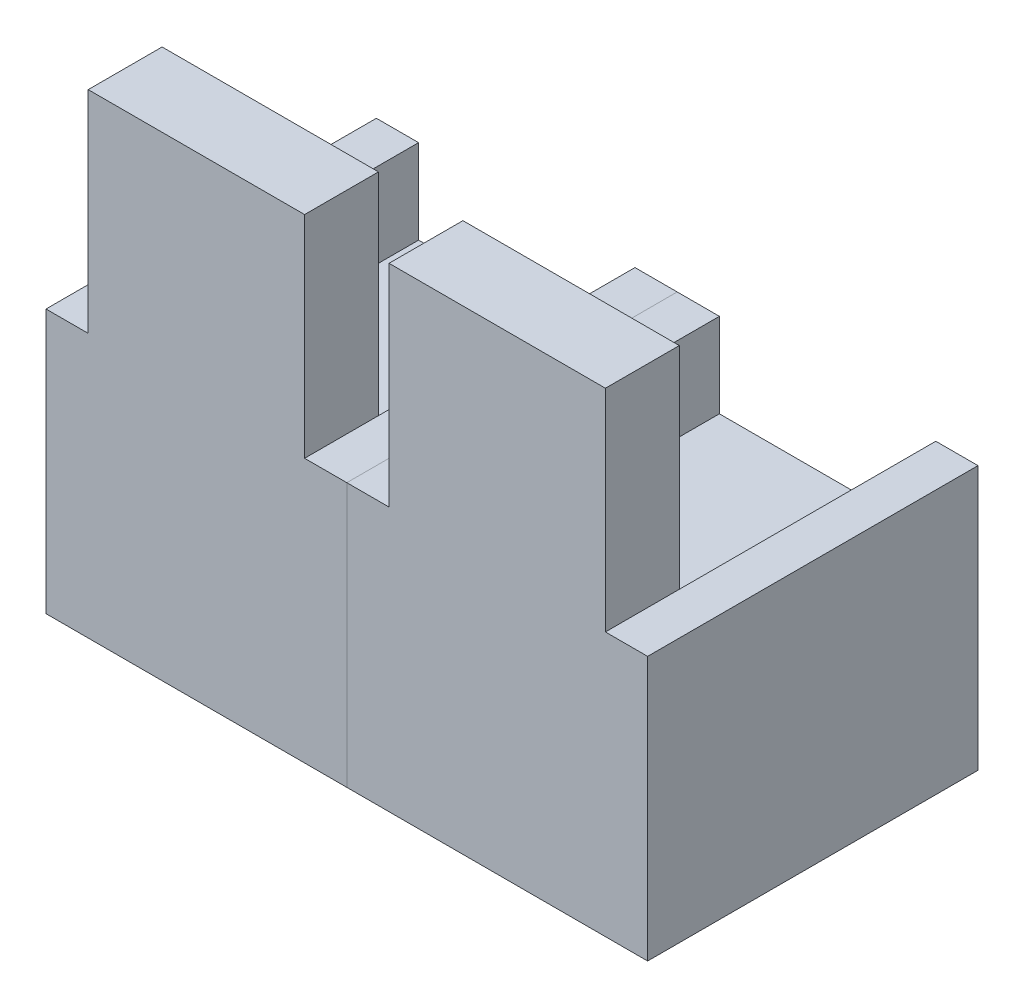
ISO-10303-21;
HEADER;
FILE_DESCRIPTION(('STEP AP214'),'2;1');
FILE_NAME('part.step','',(''),(''),'','','');
FILE_SCHEMA(('AUTOMOTIVE_DESIGN { 1 0 10303 214 1 1 1 1 }'));
ENDSEC;
DATA;
#1=APPLICATION_CONTEXT('core data for automotive mechanical design processes');
#2=APPLICATION_PROTOCOL_DEFINITION('international standard','automotive_design',2000,#1);
#3=PRODUCT_CONTEXT('',#1,'mechanical');
#4=PRODUCT('Part','Part','',(#3));
#5=PRODUCT_RELATED_PRODUCT_CATEGORY('part','',(#4));
#6=PRODUCT_DEFINITION_FORMATION('','',#4);
#7=PRODUCT_DEFINITION_CONTEXT('part definition',#1,'design');
#8=PRODUCT_DEFINITION('design','',#6,#7);
#9=PRODUCT_DEFINITION_SHAPE('','',#8);
#10=(LENGTH_UNIT() NAMED_UNIT(*) SI_UNIT(.MILLI.,.METRE.));
#11=(NAMED_UNIT(*) PLANE_ANGLE_UNIT() SI_UNIT($,.RADIAN.));
#12=(NAMED_UNIT(*) SI_UNIT($,.STERADIAN.) SOLID_ANGLE_UNIT());
#13=UNCERTAINTY_MEASURE_WITH_UNIT(LENGTH_MEASURE(1.E-05),#10,'distance_accuracy_value','');
#14=(GEOMETRIC_REPRESENTATION_CONTEXT(3) GLOBAL_UNCERTAINTY_ASSIGNED_CONTEXT((#13)) GLOBAL_UNIT_ASSIGNED_CONTEXT((#10,
#11,#12)) REPRESENTATION_CONTEXT('',''));
#15=CARTESIAN_POINT('',(0.,0.,0.));
#16=DIRECTION('',(0.,0.,1.));
#17=DIRECTION('',(1.,0.,0.));
#18=AXIS2_PLACEMENT_3D('',#15,#16,#17);
#19=CARTESIAN_POINT('',(723.9,431.8,0.));
#20=DIRECTION('',(0.,1.,0.));
#21=DIRECTION('',(0.,0.,1.));
#22=AXIS2_PLACEMENT_3D('',#19,#20,#21);
#23=PLANE('',#22);
#24=DIRECTION('',(0.,0.,-1.));
#25=VECTOR('',#24,1.);
#26=CARTESIAN_POINT('',(429.696051502146,431.8,0.));
#27=LINE('',#26,#25);
#28=CARTESIAN_POINT('',(429.696051502146,431.799999999999,617.22));
#29=VERTEX_POINT('',#28);
#30=CARTESIAN_POINT('',(429.696051502146,431.8,0.));
#31=VERTEX_POINT('',#30);
#32=EDGE_CURVE('E195',#29,#31,#27,.T.);
#33=ORIENTED_EDGE('',*,*,#32,.F.);
#34=DIRECTION('',(-1.,0.,0.));
#35=VECTOR('',#34,1.);
#36=CARTESIAN_POINT('',(429.696051502146,431.799999999999,617.22));
#37=LINE('',#36,#35);
#38=CARTESIAN_POINT('',(950.396051502146,431.799999999999,617.22));
#39=VERTEX_POINT('',#38);
#40=EDGE_CURVE('E160',#39,#29,#37,.T.);
#41=ORIENTED_EDGE('',*,*,#40,.F.);
#42=DIRECTION('',(0.,0.,1.));
#43=VECTOR('',#42,1.);
#44=CARTESIAN_POINT('',(950.396051502146,431.8,0.));
#45=LINE('',#44,#43);
#46=CARTESIAN_POINT('',(950.396051502147,431.8,0.));
#47=VERTEX_POINT('',#46);
#48=EDGE_CURVE('E66',#47,#39,#45,.T.);
#49=ORIENTED_EDGE('',*,*,#48,.F.);
#50=DIRECTION('',(-1.,0.,0.));
#51=VECTOR('',#50,1.);
#52=CARTESIAN_POINT('',(328.096051502146,431.8,0.));
#53=LINE('',#52,#51);
#54=EDGE_CURVE('E217',#47,#31,#53,.T.);
#55=ORIENTED_EDGE('',*,*,#54,.T.);
#56=EDGE_LOOP('',(#33,#41,#49,#55));
#57=FACE_BOUND('',#56,.T.);
#58=ADVANCED_FACE('F50',(#57),#23,.T.);
#59=CARTESIAN_POINT('',(429.696051502146,635.,0.));
#60=DIRECTION('',(-1.,0.,0.));
#61=DIRECTION('',(0.,0.,1.));
#62=AXIS2_PLACEMENT_3D('',#59,#60,#61);
#63=PLANE('',#62);
#64=DIRECTION('',(0.,-1.,0.));
#65=VECTOR('',#64,1.);
#66=CARTESIAN_POINT('',(429.696051502146,1143.,617.22));
#67=LINE('',#66,#65);
#68=CARTESIAN_POINT('',(429.696051502146,635.,617.22));
#69=VERTEX_POINT('',#68);
#70=EDGE_CURVE('E304',#69,#29,#67,.T.);
#71=ORIENTED_EDGE('',*,*,#70,.T.);
#72=ORIENTED_EDGE('',*,*,#32,.T.);
#73=DIRECTION('',(0.,-1.,0.));
#74=VECTOR('',#73,1.);
#75=CARTESIAN_POINT('',(429.696051502146,635.,0.));
#76=LINE('',#75,#74);
#77=CARTESIAN_POINT('',(429.696051502146,635.,0.));
#78=VERTEX_POINT('',#77);
#79=EDGE_CURVE('E210',#78,#31,#76,.T.);
#80=ORIENTED_EDGE('',*,*,#79,.F.);
#81=DIRECTION('',(0.,0.,-1.));
#82=VECTOR('',#81,1.);
#83=CARTESIAN_POINT('',(429.696051502146,635.,0.));
#84=LINE('',#83,#82);
#85=EDGE_CURVE('E203',#69,#78,#84,.T.);
#86=ORIENTED_EDGE('',*,*,#85,.F.);
#87=EDGE_LOOP('',(#71,#72,#80,#86));
#88=FACE_BOUND('',#87,.T.);
#89=ADVANCED_FACE('F257',(#88),#63,.F.);
#90=CARTESIAN_POINT('',(950.396051502146,635.000000000001,0.));
#91=DIRECTION('',(1.,0.,0.));
#92=DIRECTION('',(0.,0.,-1.));
#93=AXIS2_PLACEMENT_3D('',#90,#91,#92);
#94=PLANE('',#93);
#95=DIRECTION('',(0.,-1.,0.));
#96=VECTOR('',#95,1.);
#97=CARTESIAN_POINT('',(950.396051502147,1143.,617.22));
#98=LINE('',#97,#96);
#99=CARTESIAN_POINT('',(950.396051502146,635.000000000001,617.22));
#100=VERTEX_POINT('',#99);
#101=EDGE_CURVE('E265',#100,#39,#98,.T.);
#102=ORIENTED_EDGE('',*,*,#101,.F.);
#103=DIRECTION('',(0.,0.,1.));
#104=VECTOR('',#103,1.);
#105=CARTESIAN_POINT('',(950.396051502146,635.000000000001,0.));
#106=LINE('',#105,#104);
#107=CARTESIAN_POINT('',(950.396051502146,635.000000000001,0.));
#108=VERTEX_POINT('',#107);
#109=EDGE_CURVE('E183',#108,#100,#106,.T.);
#110=ORIENTED_EDGE('',*,*,#109,.F.);
#111=DIRECTION('',(0.,-1.,0.));
#112=VECTOR('',#111,1.);
#113=CARTESIAN_POINT('',(950.396051502146,635.000000000001,0.));
#114=LINE('',#113,#112);
#115=EDGE_CURVE('E190',#108,#47,#114,.T.);
#116=ORIENTED_EDGE('',*,*,#115,.T.);
#117=ORIENTED_EDGE('',*,*,#48,.T.);
#118=EDGE_LOOP('',(#102,#110,#116,#117));
#119=FACE_BOUND('',#118,.T.);
#120=ADVANCED_FACE('F264',(#119),#94,.F.);
#121=CARTESIAN_POINT('',(328.096051502146,431.8,0.));
#122=DIRECTION('',(1.,0.,0.));
#123=DIRECTION('',(0.,0.,-1.));
#124=AXIS2_PLACEMENT_3D('',#121,#122,#123);
#125=PLANE('',#124);
#126=DIRECTION('',(0.,0.,1.));
#127=VECTOR('',#126,1.);
#128=CARTESIAN_POINT('',(328.096051502146,0.,0.));
#129=LINE('',#128,#127);
#130=CARTESIAN_POINT('',(328.096051502146,0.,0.));
#131=VERTEX_POINT('',#130);
#132=CARTESIAN_POINT('',(328.096051502146,0.,795.020000000001));
#133=VERTEX_POINT('',#132);
#134=EDGE_CURVE('E216',#131,#133,#129,.T.);
#135=ORIENTED_EDGE('',*,*,#134,.T.);
#136=DIRECTION('',(0.,-1.,0.));
#137=VECTOR('',#136,1.);
#138=CARTESIAN_POINT('',(328.096051502146,431.8,795.020000000001));
#139=LINE('',#138,#137);
#140=CARTESIAN_POINT('',(328.096051502146,635.,795.020000000001));
#141=VERTEX_POINT('',#140);
#142=EDGE_CURVE('E12',#141,#133,#139,.T.);
#143=ORIENTED_EDGE('',*,*,#142,.F.);
#144=DIRECTION('',(0.,0.,1.));
#145=VECTOR('',#144,1.);
#146=CARTESIAN_POINT('',(328.096051502146,635.,0.));
#147=LINE('',#146,#145);
#148=CARTESIAN_POINT('',(328.096051502146,635.,0.));
#149=VERTEX_POINT('',#148);
#150=EDGE_CURVE('E196',#149,#141,#147,.T.);
#151=ORIENTED_EDGE('',*,*,#150,.F.);
#152=DIRECTION('',(0.,-1.,0.));
#153=VECTOR('',#152,1.);
#154=CARTESIAN_POINT('',(328.096051502146,431.8,0.));
#155=LINE('',#154,#153);
#156=EDGE_CURVE('E220',#149,#131,#155,.T.);
#157=ORIENTED_EDGE('',*,*,#156,.T.);
#158=EDGE_LOOP('',(#135,#143,#151,#157));
#159=FACE_BOUND('',#158,.T.);
#160=ADVANCED_FACE('F52',(#159),#125,.F.);
#161=CARTESIAN_POINT('',(328.096051502146,431.8,795.020000000001));
#162=DIRECTION('',(0.,0.,-1.));
#163=DIRECTION('',(-1.,0.,0.));
#164=AXIS2_PLACEMENT_3D('',#161,#162,#163);
#165=PLANE('',#164);
#166=DIRECTION('',(1.,0.,0.));
#167=VECTOR('',#166,1.);
#168=CARTESIAN_POINT('',(328.096051502146,0.,795.020000000001));
#169=LINE('',#168,#167);
#170=CARTESIAN_POINT('',(1051.99605150215,0.,795.020000000001));
#171=VERTEX_POINT('',#170);
#172=EDGE_CURVE('E224',#133,#171,#169,.T.);
#173=ORIENTED_EDGE('',*,*,#172,.T.);
#174=DIRECTION('',(0.,-1.,0.));
#175=VECTOR('',#174,1.);
#176=CARTESIAN_POINT('',(1051.99605150215,431.8,795.020000000001));
#177=LINE('',#176,#175);
#178=CARTESIAN_POINT('',(1051.99605150215,635.000000000001,795.020000000001));
#179=VERTEX_POINT('',#178);
#180=EDGE_CURVE('E59',#179,#171,#177,.T.);
#181=ORIENTED_EDGE('',*,*,#180,.F.);
#182=DIRECTION('',(1.,0.,0.));
#183=VECTOR('',#182,1.);
#184=CARTESIAN_POINT('',(1051.99605150215,635.000000000001,795.020000000001));
#185=LINE('',#184,#183);
#186=CARTESIAN_POINT('',(950.396051502147,635.000000000001,795.020000000001));
#187=VERTEX_POINT('',#186);
#188=EDGE_CURVE('E187',#187,#179,#185,.T.);
#189=ORIENTED_EDGE('',*,*,#188,.F.);
#190=DIRECTION('',(0.,-1.,0.));
#191=VECTOR('',#190,1.);
#192=CARTESIAN_POINT('',(950.396051502147,1143.,795.020000000001));
#193=LINE('',#192,#191);
#194=CARTESIAN_POINT('',(950.396051502147,1143.,795.020000000001));
#195=VERTEX_POINT('',#194);
#196=EDGE_CURVE('E145',#195,#187,#193,.T.);
#197=ORIENTED_EDGE('',*,*,#196,.F.);
#198=DIRECTION('',(1.,0.,0.));
#199=VECTOR('',#198,1.);
#200=CARTESIAN_POINT('',(429.696051502146,1143.,795.020000000001));
#201=LINE('',#200,#199);
#202=CARTESIAN_POINT('',(429.696051502146,1143.,795.020000000001));
#203=VERTEX_POINT('',#202);
#204=EDGE_CURVE('E137',#203,#195,#201,.T.);
#205=ORIENTED_EDGE('',*,*,#204,.F.);
#206=DIRECTION('',(0.,-1.,0.));
#207=VECTOR('',#206,1.);
#208=CARTESIAN_POINT('',(429.696051502146,1143.,795.020000000001));
#209=LINE('',#208,#207);
#210=CARTESIAN_POINT('',(429.696051502146,635.,795.020000000001));
#211=VERTEX_POINT('',#210);
#212=EDGE_CURVE('E142',#203,#211,#209,.T.);
#213=ORIENTED_EDGE('',*,*,#212,.T.);
#214=DIRECTION('',(1.,0.,0.));
#215=VECTOR('',#214,1.);
#216=CARTESIAN_POINT('',(328.096051502146,635.,795.020000000001));
#217=LINE('',#216,#215);
#218=EDGE_CURVE('E200',#141,#211,#217,.T.);
#219=ORIENTED_EDGE('',*,*,#218,.F.);
#220=ORIENTED_EDGE('',*,*,#142,.T.);
#221=EDGE_LOOP('',(#173,#181,#189,#197,#205,#213,#219,#220));
#222=FACE_BOUND('',#221,.T.);
#223=ADVANCED_FACE('F139',(#222),#165,.F.);
#224=CARTESIAN_POINT('',(1051.99605150215,431.8,0.));
#225=DIRECTION('',(-1.,0.,0.));
#226=DIRECTION('',(0.,0.,1.));
#227=AXIS2_PLACEMENT_3D('',#224,#225,#226);
#228=PLANE('',#227);
#229=DIRECTION('',(0.,0.,-1.));
#230=VECTOR('',#229,1.);
#231=CARTESIAN_POINT('',(1051.99605150215,0.,0.));
#232=LINE('',#231,#230);
#233=CARTESIAN_POINT('',(1051.99605150215,0.,0.));
#234=VERTEX_POINT('',#233);
#235=EDGE_CURVE('E227',#171,#234,#232,.T.);
#236=ORIENTED_EDGE('',*,*,#235,.T.);
#237=DIRECTION('',(0.,-1.,0.));
#238=VECTOR('',#237,1.);
#239=CARTESIAN_POINT('',(1051.99605150215,431.8,0.));
#240=LINE('',#239,#238);
#241=CARTESIAN_POINT('',(1051.99605150215,635.000000000001,0.));
#242=VERTEX_POINT('',#241);
#243=EDGE_CURVE('E234',#242,#234,#240,.T.);
#244=ORIENTED_EDGE('',*,*,#243,.F.);
#245=DIRECTION('',(0.,0.,-1.));
#246=VECTOR('',#245,1.);
#247=CARTESIAN_POINT('',(1051.99605150215,635.000000000001,0.));
#248=LINE('',#247,#246);
#249=EDGE_CURVE('E170',#179,#242,#248,.T.);
#250=ORIENTED_EDGE('',*,*,#249,.F.);
#251=ORIENTED_EDGE('',*,*,#180,.T.);
#252=EDGE_LOOP('',(#236,#244,#250,#251));
#253=FACE_BOUND('',#252,.T.);
#254=ADVANCED_FACE('F242',(#253),#228,.F.);
#255=CARTESIAN_POINT('',(328.096051502146,431.8,0.));
#256=DIRECTION('',(0.,0.,1.));
#257=DIRECTION('',(1.,0.,0.));
#258=AXIS2_PLACEMENT_3D('',#255,#256,#257);
#259=PLANE('',#258);
#260=DIRECTION('',(-1.,0.,0.));
#261=VECTOR('',#260,1.);
#262=CARTESIAN_POINT('',(328.096051502146,0.,0.));
#263=LINE('',#262,#261);
#264=EDGE_CURVE('E74',#234,#131,#263,.T.);
#265=ORIENTED_EDGE('',*,*,#264,.T.);
#266=ORIENTED_EDGE('',*,*,#156,.F.);
#267=DIRECTION('',(-1.,0.,0.));
#268=VECTOR('',#267,1.);
#269=CARTESIAN_POINT('',(328.096051502146,635.,0.));
#270=LINE('',#269,#268);
#271=EDGE_CURVE('E206',#78,#149,#270,.T.);
#272=ORIENTED_EDGE('',*,*,#271,.F.);
#273=ORIENTED_EDGE('',*,*,#79,.T.);
#274=ORIENTED_EDGE('',*,*,#54,.F.);
#275=ORIENTED_EDGE('',*,*,#115,.F.);
#276=DIRECTION('',(-1.,0.,0.));
#277=VECTOR('',#276,1.);
#278=CARTESIAN_POINT('',(1051.99605150215,635.000000000001,0.));
#279=LINE('',#278,#277);
#280=EDGE_CURVE('E179',#242,#108,#279,.T.);
#281=ORIENTED_EDGE('',*,*,#280,.F.);
#282=ORIENTED_EDGE('',*,*,#243,.T.);
#283=EDGE_LOOP('',(#265,#266,#272,#273,#274,#275,#281,#282));
#284=FACE_BOUND('',#283,.T.);
#285=ADVANCED_FACE('F249',(#284),#259,.F.);
#286=CARTESIAN_POINT('',(723.9,0.,0.));
#287=DIRECTION('',(0.,1.,0.));
#288=DIRECTION('',(0.,0.,1.));
#289=AXIS2_PLACEMENT_3D('',#286,#287,#288);
#290=PLANE('',#289);
#291=ORIENTED_EDGE('',*,*,#134,.F.);
#292=ORIENTED_EDGE('',*,*,#264,.F.);
#293=ORIENTED_EDGE('',*,*,#235,.F.);
#294=ORIENTED_EDGE('',*,*,#172,.F.);
#295=EDGE_LOOP('',(#291,#292,#293,#294));
#296=FACE_BOUND('',#295,.T.);
#297=ADVANCED_FACE('F245',(#296),#290,.F.);
#298=CARTESIAN_POINT('',(723.9,635.000000000001,0.));
#299=DIRECTION('',(0.,1.,0.));
#300=DIRECTION('',(0.,0.,1.));
#301=AXIS2_PLACEMENT_3D('',#298,#299,#300);
#302=PLANE('',#301);
#303=ORIENTED_EDGE('',*,*,#150,.T.);
#304=ORIENTED_EDGE('',*,*,#218,.T.);
#305=EDGE_CURVE('E164',#211,#69,#84,.T.);
#306=ORIENTED_EDGE('',*,*,#305,.T.);
#307=ORIENTED_EDGE('',*,*,#85,.T.);
#308=ORIENTED_EDGE('',*,*,#271,.T.);
#309=EDGE_LOOP('',(#303,#304,#306,#307,#308));
#310=FACE_BOUND('',#309,.T.);
#311=ADVANCED_FACE('F251',(#310),#302,.T.);
#312=CARTESIAN_POINT('',(723.9,635.000000000001,0.));
#313=DIRECTION('',(0.,-1.,0.));
#314=DIRECTION('',(0.,0.,-1.));
#315=AXIS2_PLACEMENT_3D('',#312,#313,#314);
#316=PLANE('',#315);
#317=ORIENTED_EDGE('',*,*,#249,.T.);
#318=ORIENTED_EDGE('',*,*,#280,.T.);
#319=ORIENTED_EDGE('',*,*,#109,.T.);
#320=EDGE_CURVE('E182',#100,#187,#106,.T.);
#321=ORIENTED_EDGE('',*,*,#320,.T.);
#322=ORIENTED_EDGE('',*,*,#188,.T.);
#323=EDGE_LOOP('',(#317,#318,#319,#321,#322));
#324=FACE_BOUND('',#323,.T.);
#325=ADVANCED_FACE('F268',(#324),#316,.F.);
#326=CARTESIAN_POINT('',(950.396051502147,1143.,617.22));
#327=DIRECTION('',(-1.,0.,0.));
#328=DIRECTION('',(0.,0.,1.));
#329=AXIS2_PLACEMENT_3D('',#326,#327,#328);
#330=PLANE('',#329);
#331=ORIENTED_EDGE('',*,*,#196,.T.);
#332=ORIENTED_EDGE('',*,*,#320,.F.);
#333=CARTESIAN_POINT('',(950.396051502147,1143.,617.22));
#334=VERTEX_POINT('',#333);
#335=EDGE_CURVE('E172',#334,#100,#98,.T.);
#336=ORIENTED_EDGE('',*,*,#335,.F.);
#337=DIRECTION('',(0.,0.,-1.));
#338=VECTOR('',#337,1.);
#339=CARTESIAN_POINT('',(950.396051502147,1143.,617.22));
#340=LINE('',#339,#338);
#341=EDGE_CURVE('E149',#195,#334,#340,.T.);
#342=ORIENTED_EDGE('',*,*,#341,.F.);
#343=EDGE_LOOP('',(#331,#332,#336,#342));
#344=FACE_BOUND('',#343,.T.);
#345=ADVANCED_FACE('F294',(#344),#330,.F.);
#346=CARTESIAN_POINT('',(429.696051502146,1143.,617.22));
#347=DIRECTION('',(1.,0.,0.));
#348=DIRECTION('',(0.,0.,-1.));
#349=AXIS2_PLACEMENT_3D('',#346,#347,#348);
#350=PLANE('',#349);
#351=ORIENTED_EDGE('',*,*,#305,.F.);
#352=ORIENTED_EDGE('',*,*,#212,.F.);
#353=DIRECTION('',(0.,0.,1.));
#354=VECTOR('',#353,1.);
#355=CARTESIAN_POINT('',(429.696051502146,1143.,617.22));
#356=LINE('',#355,#354);
#357=CARTESIAN_POINT('',(429.696051502146,1143.,617.22));
#358=VERTEX_POINT('',#357);
#359=EDGE_CURVE('E150',#358,#203,#356,.T.);
#360=ORIENTED_EDGE('',*,*,#359,.F.);
#361=EDGE_CURVE('E300',#358,#69,#67,.T.);
#362=ORIENTED_EDGE('',*,*,#361,.T.);
#363=EDGE_LOOP('',(#351,#352,#360,#362));
#364=FACE_BOUND('',#363,.T.);
#365=ADVANCED_FACE('F162',(#364),#350,.F.);
#366=CARTESIAN_POINT('',(429.696051502146,1143.,617.22));
#367=DIRECTION('',(0.,0.,1.));
#368=DIRECTION('',(1.,0.,0.));
#369=AXIS2_PLACEMENT_3D('',#366,#367,#368);
#370=PLANE('',#369);
#371=ORIENTED_EDGE('',*,*,#40,.T.);
#372=ORIENTED_EDGE('',*,*,#70,.F.);
#373=ORIENTED_EDGE('',*,*,#361,.F.);
#374=DIRECTION('',(-1.,0.,0.));
#375=VECTOR('',#374,1.);
#376=CARTESIAN_POINT('',(429.696051502146,1143.,617.22));
#377=LINE('',#376,#375);
#378=EDGE_CURVE('E155',#334,#358,#377,.T.);
#379=ORIENTED_EDGE('',*,*,#378,.F.);
#380=ORIENTED_EDGE('',*,*,#335,.T.);
#381=ORIENTED_EDGE('',*,*,#101,.T.);
#382=EDGE_LOOP('',(#371,#372,#373,#379,#380,#381));
#383=FACE_BOUND('',#382,.T.);
#384=ADVANCED_FACE('F296',(#383),#370,.F.);
#385=CARTESIAN_POINT('',(723.9,1143.,0.));
#386=DIRECTION('',(0.,1.,0.));
#387=DIRECTION('',(0.,0.,1.));
#388=AXIS2_PLACEMENT_3D('',#385,#386,#387);
#389=PLANE('',#388);
#390=ORIENTED_EDGE('',*,*,#359,.T.);
#391=ORIENTED_EDGE('',*,*,#204,.T.);
#392=ORIENTED_EDGE('',*,*,#341,.T.);
#393=ORIENTED_EDGE('',*,*,#378,.T.);
#394=EDGE_LOOP('',(#390,#391,#392,#393));
#395=FACE_BOUND('',#394,.T.);
#396=ADVANCED_FACE('F153',(#395),#389,.T.);
#397=CLOSED_SHELL('',(#58,#89,#120,#160,#223,#254,#285,#297,#311,#325,#345,#365,#384,#396));
#398=MANIFOLD_SOLID_BREP('B2',#397);
#399=CARTESIAN_POINT('',(0.,431.8,0.));
#400=DIRECTION('',(0.,1.,0.));
#401=DIRECTION('',(0.,0.,1.));
#402=AXIS2_PLACEMENT_3D('',#399,#400,#401);
#403=PLANE('',#402);
#404=DIRECTION('',(0.,0.,-1.));
#405=VECTOR('',#404,1.);
#406=CARTESIAN_POINT('',(-294.203948497854,431.8,0.));
#407=LINE('',#406,#405);
#408=CARTESIAN_POINT('',(-294.203948497853,431.799999999999,617.22));
#409=VERTEX_POINT('',#408);
#410=CARTESIAN_POINT('',(-294.203948497854,431.8,0.));
#411=VERTEX_POINT('',#410);
#412=EDGE_CURVE('E599',#409,#411,#407,.T.);
#413=ORIENTED_EDGE('',*,*,#412,.F.);
#414=DIRECTION('',(-1.,0.,0.));
#415=VECTOR('',#414,1.);
#416=CARTESIAN_POINT('',(-294.203948497853,431.799999999999,617.22));
#417=LINE('',#416,#415);
#418=CARTESIAN_POINT('',(226.496051502147,431.799999999999,617.22));
#419=VERTEX_POINT('',#418);
#420=EDGE_CURVE('E564',#419,#409,#417,.T.);
#421=ORIENTED_EDGE('',*,*,#420,.F.);
#422=DIRECTION('',(0.,0.,1.));
#423=VECTOR('',#422,1.);
#424=CARTESIAN_POINT('',(226.496051502146,431.8,0.));
#425=LINE('',#424,#423);
#426=CARTESIAN_POINT('',(226.496051502146,431.8,0.));
#427=VERTEX_POINT('',#426);
#428=EDGE_CURVE('E470',#427,#419,#425,.T.);
#429=ORIENTED_EDGE('',*,*,#428,.F.);
#430=DIRECTION('',(-1.,0.,0.));
#431=VECTOR('',#430,1.);
#432=CARTESIAN_POINT('',(-395.803948497854,431.8,0.));
#433=LINE('',#432,#431);
#434=EDGE_CURVE('E621',#427,#411,#433,.T.);
#435=ORIENTED_EDGE('',*,*,#434,.T.);
#436=EDGE_LOOP('',(#413,#421,#429,#435));
#437=FACE_BOUND('',#436,.T.);
#438=ADVANCED_FACE('F454',(#437),#403,.T.);
#439=CARTESIAN_POINT('',(-294.203948497854,635.000000000001,0.));
#440=DIRECTION('',(-1.,0.,0.));
#441=DIRECTION('',(0.,0.,1.));
#442=AXIS2_PLACEMENT_3D('',#439,#440,#441);
#443=PLANE('',#442);
#444=DIRECTION('',(0.,-1.,0.));
#445=VECTOR('',#444,1.);
#446=CARTESIAN_POINT('',(-294.203948497854,1143.,617.22));
#447=LINE('',#446,#445);
#448=CARTESIAN_POINT('',(-294.203948497853,635.000000000001,617.22));
#449=VERTEX_POINT('',#448);
#450=EDGE_CURVE('E708',#449,#409,#447,.T.);
#451=ORIENTED_EDGE('',*,*,#450,.T.);
#452=ORIENTED_EDGE('',*,*,#412,.T.);
#453=DIRECTION('',(0.,-1.,0.));
#454=VECTOR('',#453,1.);
#455=CARTESIAN_POINT('',(-294.203948497854,635.000000000001,0.));
#456=LINE('',#455,#454);
#457=CARTESIAN_POINT('',(-294.203948497854,635.000000000001,0.));
#458=VERTEX_POINT('',#457);
#459=EDGE_CURVE('E614',#458,#411,#456,.T.);
#460=ORIENTED_EDGE('',*,*,#459,.F.);
#461=DIRECTION('',(0.,0.,-1.));
#462=VECTOR('',#461,1.);
#463=CARTESIAN_POINT('',(-294.203948497854,635.000000000001,0.));
#464=LINE('',#463,#462);
#465=EDGE_CURVE('E607',#449,#458,#464,.T.);
#466=ORIENTED_EDGE('',*,*,#465,.F.);
#467=EDGE_LOOP('',(#451,#452,#460,#466));
#468=FACE_BOUND('',#467,.T.);
#469=ADVANCED_FACE('F661',(#468),#443,.F.);
#470=CARTESIAN_POINT('',(226.496051502146,635.,0.));
#471=DIRECTION('',(1.,0.,0.));
#472=DIRECTION('',(0.,0.,-1.));
#473=AXIS2_PLACEMENT_3D('',#470,#471,#472);
#474=PLANE('',#473);
#475=DIRECTION('',(0.,-1.,0.));
#476=VECTOR('',#475,1.);
#477=CARTESIAN_POINT('',(226.496051502146,1143.,617.22));
#478=LINE('',#477,#476);
#479=CARTESIAN_POINT('',(226.496051502147,635.,617.22));
#480=VERTEX_POINT('',#479);
#481=EDGE_CURVE('E669',#480,#419,#478,.T.);
#482=ORIENTED_EDGE('',*,*,#481,.F.);
#483=DIRECTION('',(0.,0.,1.));
#484=VECTOR('',#483,1.);
#485=CARTESIAN_POINT('',(226.496051502146,635.,0.));
#486=LINE('',#485,#484);
#487=CARTESIAN_POINT('',(226.496051502146,635.,0.));
#488=VERTEX_POINT('',#487);
#489=EDGE_CURVE('E587',#488,#480,#486,.T.);
#490=ORIENTED_EDGE('',*,*,#489,.F.);
#491=DIRECTION('',(0.,-1.,0.));
#492=VECTOR('',#491,1.);
#493=CARTESIAN_POINT('',(226.496051502146,635.,0.));
#494=LINE('',#493,#492);
#495=EDGE_CURVE('E594',#488,#427,#494,.T.);
#496=ORIENTED_EDGE('',*,*,#495,.T.);
#497=ORIENTED_EDGE('',*,*,#428,.T.);
#498=EDGE_LOOP('',(#482,#490,#496,#497));
#499=FACE_BOUND('',#498,.T.);
#500=ADVANCED_FACE('F668',(#499),#474,.F.);
#501=CARTESIAN_POINT('',(-395.803948497854,431.8,0.));
#502=DIRECTION('',(1.,0.,0.));
#503=DIRECTION('',(0.,0.,-1.));
#504=AXIS2_PLACEMENT_3D('',#501,#502,#503);
#505=PLANE('',#504);
#506=DIRECTION('',(0.,0.,1.));
#507=VECTOR('',#506,1.);
#508=CARTESIAN_POINT('',(-395.803948497854,0.,0.));
#509=LINE('',#508,#507);
#510=CARTESIAN_POINT('',(-395.803948497854,0.,0.));
#511=VERTEX_POINT('',#510);
#512=CARTESIAN_POINT('',(-395.803948497853,0.,795.020000000001));
#513=VERTEX_POINT('',#512);
#514=EDGE_CURVE('E620',#511,#513,#509,.T.);
#515=ORIENTED_EDGE('',*,*,#514,.T.);
#516=DIRECTION('',(0.,-1.,0.));
#517=VECTOR('',#516,1.);
#518=CARTESIAN_POINT('',(-395.803948497853,431.8,795.020000000001));
#519=LINE('',#518,#517);
#520=CARTESIAN_POINT('',(-395.803948497853,635.000000000001,795.020000000001));
#521=VERTEX_POINT('',#520);
#522=EDGE_CURVE('E48',#521,#513,#519,.T.);
#523=ORIENTED_EDGE('',*,*,#522,.F.);
#524=DIRECTION('',(0.,0.,1.));
#525=VECTOR('',#524,1.);
#526=CARTESIAN_POINT('',(-395.803948497854,635.000000000001,0.));
#527=LINE('',#526,#525);
#528=CARTESIAN_POINT('',(-395.803948497854,635.000000000001,0.));
#529=VERTEX_POINT('',#528);
#530=EDGE_CURVE('E600',#529,#521,#527,.T.);
#531=ORIENTED_EDGE('',*,*,#530,.F.);
#532=DIRECTION('',(0.,-1.,0.));
#533=VECTOR('',#532,1.);
#534=CARTESIAN_POINT('',(-395.803948497854,431.8,0.));
#535=LINE('',#534,#533);
#536=EDGE_CURVE('E624',#529,#511,#535,.T.);
#537=ORIENTED_EDGE('',*,*,#536,.T.);
#538=EDGE_LOOP('',(#515,#523,#531,#537));
#539=FACE_BOUND('',#538,.T.);
#540=ADVANCED_FACE('F456',(#539),#505,.F.);
#541=CARTESIAN_POINT('',(-395.803948497853,431.8,795.020000000001));
#542=DIRECTION('',(0.,0.,-1.));
#543=DIRECTION('',(-1.,0.,0.));
#544=AXIS2_PLACEMENT_3D('',#541,#542,#543);
#545=PLANE('',#544);
#546=DIRECTION('',(1.,0.,0.));
#547=VECTOR('',#546,1.);
#548=CARTESIAN_POINT('',(-395.803948497853,0.,795.020000000001));
#549=LINE('',#548,#547);
#550=CARTESIAN_POINT('',(328.096051502146,0.,795.020000000001));
#551=VERTEX_POINT('',#550);
#552=EDGE_CURVE('E628',#513,#551,#549,.T.);
#553=ORIENTED_EDGE('',*,*,#552,.T.);
#554=DIRECTION('',(0.,-1.,0.));
#555=VECTOR('',#554,1.);
#556=CARTESIAN_POINT('',(328.096051502146,431.8,795.020000000001));
#557=LINE('',#556,#555);
#558=CARTESIAN_POINT('',(328.096051502146,635.,795.020000000001));
#559=VERTEX_POINT('',#558);
#560=EDGE_CURVE('E463',#559,#551,#557,.T.);
#561=ORIENTED_EDGE('',*,*,#560,.F.);
#562=DIRECTION('',(1.,0.,0.));
#563=VECTOR('',#562,1.);
#564=CARTESIAN_POINT('',(328.096051502146,635.,795.020000000001));
#565=LINE('',#564,#563);
#566=CARTESIAN_POINT('',(226.496051502146,635.,795.020000000001));
#567=VERTEX_POINT('',#566);
#568=EDGE_CURVE('E591',#567,#559,#565,.T.);
#569=ORIENTED_EDGE('',*,*,#568,.F.);
#570=DIRECTION('',(0.,-1.,0.));
#571=VECTOR('',#570,1.);
#572=CARTESIAN_POINT('',(226.496051502147,1143.,795.020000000001));
#573=LINE('',#572,#571);
#574=CARTESIAN_POINT('',(226.496051502147,1143.,795.020000000001));
#575=VERTEX_POINT('',#574);
#576=EDGE_CURVE('E549',#575,#567,#573,.T.);
#577=ORIENTED_EDGE('',*,*,#576,.F.);
#578=DIRECTION('',(1.,0.,0.));
#579=VECTOR('',#578,1.);
#580=CARTESIAN_POINT('',(-294.203948497854,1143.,795.020000000001));
#581=LINE('',#580,#579);
#582=CARTESIAN_POINT('',(-294.203948497854,1143.,795.020000000001));
#583=VERTEX_POINT('',#582);
#584=EDGE_CURVE('E541',#583,#575,#581,.T.);
#585=ORIENTED_EDGE('',*,*,#584,.F.);
#586=DIRECTION('',(0.,-1.,0.));
#587=VECTOR('',#586,1.);
#588=CARTESIAN_POINT('',(-294.203948497854,1143.,795.020000000001));
#589=LINE('',#588,#587);
#590=CARTESIAN_POINT('',(-294.203948497853,635.000000000001,795.020000000001));
#591=VERTEX_POINT('',#590);
#592=EDGE_CURVE('E546',#583,#591,#589,.T.);
#593=ORIENTED_EDGE('',*,*,#592,.T.);
#594=DIRECTION('',(1.,0.,0.));
#595=VECTOR('',#594,1.);
#596=CARTESIAN_POINT('',(-395.803948497853,635.000000000001,795.020000000001));
#597=LINE('',#596,#595);
#598=EDGE_CURVE('E604',#521,#591,#597,.T.);
#599=ORIENTED_EDGE('',*,*,#598,.F.);
#600=ORIENTED_EDGE('',*,*,#522,.T.);
#601=EDGE_LOOP('',(#553,#561,#569,#577,#585,#593,#599,#600));
#602=FACE_BOUND('',#601,.T.);
#603=ADVANCED_FACE('F543',(#602),#545,.F.);
#604=CARTESIAN_POINT('',(328.096051502146,431.8,0.));
#605=DIRECTION('',(-1.,0.,0.));
#606=DIRECTION('',(0.,0.,1.));
#607=AXIS2_PLACEMENT_3D('',#604,#605,#606);
#608=PLANE('',#607);
#609=DIRECTION('',(0.,0.,-1.));
#610=VECTOR('',#609,1.);
#611=CARTESIAN_POINT('',(328.096051502146,0.,0.));
#612=LINE('',#611,#610);
#613=CARTESIAN_POINT('',(328.096051502146,0.,0.));
#614=VERTEX_POINT('',#613);
#615=EDGE_CURVE('E631',#551,#614,#612,.T.);
#616=ORIENTED_EDGE('',*,*,#615,.T.);
#617=DIRECTION('',(0.,-1.,0.));
#618=VECTOR('',#617,1.);
#619=CARTESIAN_POINT('',(328.096051502146,431.8,0.));
#620=LINE('',#619,#618);
#621=CARTESIAN_POINT('',(328.096051502146,635.,0.));
#622=VERTEX_POINT('',#621);
#623=EDGE_CURVE('E638',#622,#614,#620,.T.);
#624=ORIENTED_EDGE('',*,*,#623,.F.);
#625=DIRECTION('',(0.,0.,-1.));
#626=VECTOR('',#625,1.);
#627=CARTESIAN_POINT('',(328.096051502146,635.,0.));
#628=LINE('',#627,#626);
#629=EDGE_CURVE('E574',#559,#622,#628,.T.);
#630=ORIENTED_EDGE('',*,*,#629,.F.);
#631=ORIENTED_EDGE('',*,*,#560,.T.);
#632=EDGE_LOOP('',(#616,#624,#630,#631));
#633=FACE_BOUND('',#632,.T.);
#634=ADVANCED_FACE('F646',(#633),#608,.F.);
#635=CARTESIAN_POINT('',(-395.803948497854,431.8,0.));
#636=DIRECTION('',(0.,0.,1.));
#637=DIRECTION('',(1.,0.,0.));
#638=AXIS2_PLACEMENT_3D('',#635,#636,#637);
#639=PLANE('',#638);
#640=DIRECTION('',(-1.,0.,0.));
#641=VECTOR('',#640,1.);
#642=CARTESIAN_POINT('',(-395.803948497854,0.,0.));
#643=LINE('',#642,#641);
#644=EDGE_CURVE('E478',#614,#511,#643,.T.);
#645=ORIENTED_EDGE('',*,*,#644,.T.);
#646=ORIENTED_EDGE('',*,*,#536,.F.);
#647=DIRECTION('',(-1.,0.,0.));
#648=VECTOR('',#647,1.);
#649=CARTESIAN_POINT('',(-395.803948497854,635.000000000001,0.));
#650=LINE('',#649,#648);
#651=EDGE_CURVE('E610',#458,#529,#650,.T.);
#652=ORIENTED_EDGE('',*,*,#651,.F.);
#653=ORIENTED_EDGE('',*,*,#459,.T.);
#654=ORIENTED_EDGE('',*,*,#434,.F.);
#655=ORIENTED_EDGE('',*,*,#495,.F.);
#656=DIRECTION('',(-1.,0.,0.));
#657=VECTOR('',#656,1.);
#658=CARTESIAN_POINT('',(328.096051502146,635.,0.));
#659=LINE('',#658,#657);
#660=EDGE_CURVE('E583',#622,#488,#659,.T.);
#661=ORIENTED_EDGE('',*,*,#660,.F.);
#662=ORIENTED_EDGE('',*,*,#623,.T.);
#663=EDGE_LOOP('',(#645,#646,#652,#653,#654,#655,#661,#662));
#664=FACE_BOUND('',#663,.T.);
#665=ADVANCED_FACE('F653',(#664),#639,.F.);
#666=CARTESIAN_POINT('',(0.,0.,0.));
#667=DIRECTION('',(0.,1.,0.));
#668=DIRECTION('',(0.,0.,1.));
#669=AXIS2_PLACEMENT_3D('',#666,#667,#668);
#670=PLANE('',#669);
#671=ORIENTED_EDGE('',*,*,#514,.F.);
#672=ORIENTED_EDGE('',*,*,#644,.F.);
#673=ORIENTED_EDGE('',*,*,#615,.F.);
#674=ORIENTED_EDGE('',*,*,#552,.F.);
#675=EDGE_LOOP('',(#671,#672,#673,#674));
#676=FACE_BOUND('',#675,.T.);
#677=ADVANCED_FACE('F649',(#676),#670,.F.);
#678=CARTESIAN_POINT('',(0.,635.,0.));
#679=DIRECTION('',(0.,1.,0.));
#680=DIRECTION('',(0.,0.,1.));
#681=AXIS2_PLACEMENT_3D('',#678,#679,#680);
#682=PLANE('',#681);
#683=ORIENTED_EDGE('',*,*,#530,.T.);
#684=ORIENTED_EDGE('',*,*,#598,.T.);
#685=EDGE_CURVE('E568',#591,#449,#464,.T.);
#686=ORIENTED_EDGE('',*,*,#685,.T.);
#687=ORIENTED_EDGE('',*,*,#465,.T.);
#688=ORIENTED_EDGE('',*,*,#651,.T.);
#689=EDGE_LOOP('',(#683,#684,#686,#687,#688));
#690=FACE_BOUND('',#689,.T.);
#691=ADVANCED_FACE('F655',(#690),#682,.T.);
#692=CARTESIAN_POINT('',(0.,635.,0.));
#693=DIRECTION('',(0.,-1.,0.));
#694=DIRECTION('',(0.,0.,-1.));
#695=AXIS2_PLACEMENT_3D('',#692,#693,#694);
#696=PLANE('',#695);
#697=ORIENTED_EDGE('',*,*,#629,.T.);
#698=ORIENTED_EDGE('',*,*,#660,.T.);
#699=ORIENTED_EDGE('',*,*,#489,.T.);
#700=EDGE_CURVE('E586',#480,#567,#486,.T.);
#701=ORIENTED_EDGE('',*,*,#700,.T.);
#702=ORIENTED_EDGE('',*,*,#568,.T.);
#703=EDGE_LOOP('',(#697,#698,#699,#701,#702));
#704=FACE_BOUND('',#703,.T.);
#705=ADVANCED_FACE('F672',(#704),#696,.F.);
#706=CARTESIAN_POINT('',(226.496051502146,1143.,617.22));
#707=DIRECTION('',(-1.,0.,0.));
#708=DIRECTION('',(0.,0.,1.));
#709=AXIS2_PLACEMENT_3D('',#706,#707,#708);
#710=PLANE('',#709);
#711=ORIENTED_EDGE('',*,*,#576,.T.);
#712=ORIENTED_EDGE('',*,*,#700,.F.);
#713=CARTESIAN_POINT('',(226.496051502146,1143.,617.22));
#714=VERTEX_POINT('',#713);
#715=EDGE_CURVE('E576',#714,#480,#478,.T.);
#716=ORIENTED_EDGE('',*,*,#715,.F.);
#717=DIRECTION('',(0.,0.,-1.));
#718=VECTOR('',#717,1.);
#719=CARTESIAN_POINT('',(226.496051502146,1143.,617.22));
#720=LINE('',#719,#718);
#721=EDGE_CURVE('E553',#575,#714,#720,.T.);
#722=ORIENTED_EDGE('',*,*,#721,.F.);
#723=EDGE_LOOP('',(#711,#712,#716,#722));
#724=FACE_BOUND('',#723,.T.);
#725=ADVANCED_FACE('F698',(#724),#710,.F.);
#726=CARTESIAN_POINT('',(-294.203948497854,1143.,617.22));
#727=DIRECTION('',(1.,0.,0.));
#728=DIRECTION('',(0.,0.,-1.));
#729=AXIS2_PLACEMENT_3D('',#726,#727,#728);
#730=PLANE('',#729);
#731=ORIENTED_EDGE('',*,*,#685,.F.);
#732=ORIENTED_EDGE('',*,*,#592,.F.);
#733=DIRECTION('',(0.,0.,1.));
#734=VECTOR('',#733,1.);
#735=CARTESIAN_POINT('',(-294.203948497854,1143.,617.22));
#736=LINE('',#735,#734);
#737=CARTESIAN_POINT('',(-294.203948497854,1143.,617.22));
#738=VERTEX_POINT('',#737);
#739=EDGE_CURVE('E554',#738,#583,#736,.T.);
#740=ORIENTED_EDGE('',*,*,#739,.F.);
#741=EDGE_CURVE('E704',#738,#449,#447,.T.);
#742=ORIENTED_EDGE('',*,*,#741,.T.);
#743=EDGE_LOOP('',(#731,#732,#740,#742));
#744=FACE_BOUND('',#743,.T.);
#745=ADVANCED_FACE('F566',(#744),#730,.F.);
#746=CARTESIAN_POINT('',(-294.203948497854,1143.,617.22));
#747=DIRECTION('',(0.,0.,1.));
#748=DIRECTION('',(1.,0.,0.));
#749=AXIS2_PLACEMENT_3D('',#746,#747,#748);
#750=PLANE('',#749);
#751=ORIENTED_EDGE('',*,*,#420,.T.);
#752=ORIENTED_EDGE('',*,*,#450,.F.);
#753=ORIENTED_EDGE('',*,*,#741,.F.);
#754=DIRECTION('',(-1.,0.,0.));
#755=VECTOR('',#754,1.);
#756=CARTESIAN_POINT('',(-294.203948497854,1143.,617.22));
#757=LINE('',#756,#755);
#758=EDGE_CURVE('E559',#714,#738,#757,.T.);
#759=ORIENTED_EDGE('',*,*,#758,.F.);
#760=ORIENTED_EDGE('',*,*,#715,.T.);
#761=ORIENTED_EDGE('',*,*,#481,.T.);
#762=EDGE_LOOP('',(#751,#752,#753,#759,#760,#761));
#763=FACE_BOUND('',#762,.T.);
#764=ADVANCED_FACE('F700',(#763),#750,.F.);
#765=CARTESIAN_POINT('',(0.,1143.,0.));
#766=DIRECTION('',(0.,1.,0.));
#767=DIRECTION('',(0.,0.,1.));
#768=AXIS2_PLACEMENT_3D('',#765,#766,#767);
#769=PLANE('',#768);
#770=ORIENTED_EDGE('',*,*,#739,.T.);
#771=ORIENTED_EDGE('',*,*,#584,.T.);
#772=ORIENTED_EDGE('',*,*,#721,.T.);
#773=ORIENTED_EDGE('',*,*,#758,.T.);
#774=EDGE_LOOP('',(#770,#771,#772,#773));
#775=FACE_BOUND('',#774,.T.);
#776=ADVANCED_FACE('F557',(#775),#769,.T.);
#777=CLOSED_SHELL('',(#438,#469,#500,#540,#603,#634,#665,#677,#691,#705,#725,#745,#764,#776));
#778=MANIFOLD_SOLID_BREP('B6',#777);
#779=ADVANCED_BREP_SHAPE_REPRESENTATION('',(#18,#398,#778),#14);
#780=SHAPE_DEFINITION_REPRESENTATION(#9,#779);
ENDSEC;
END-ISO-10303-21;
